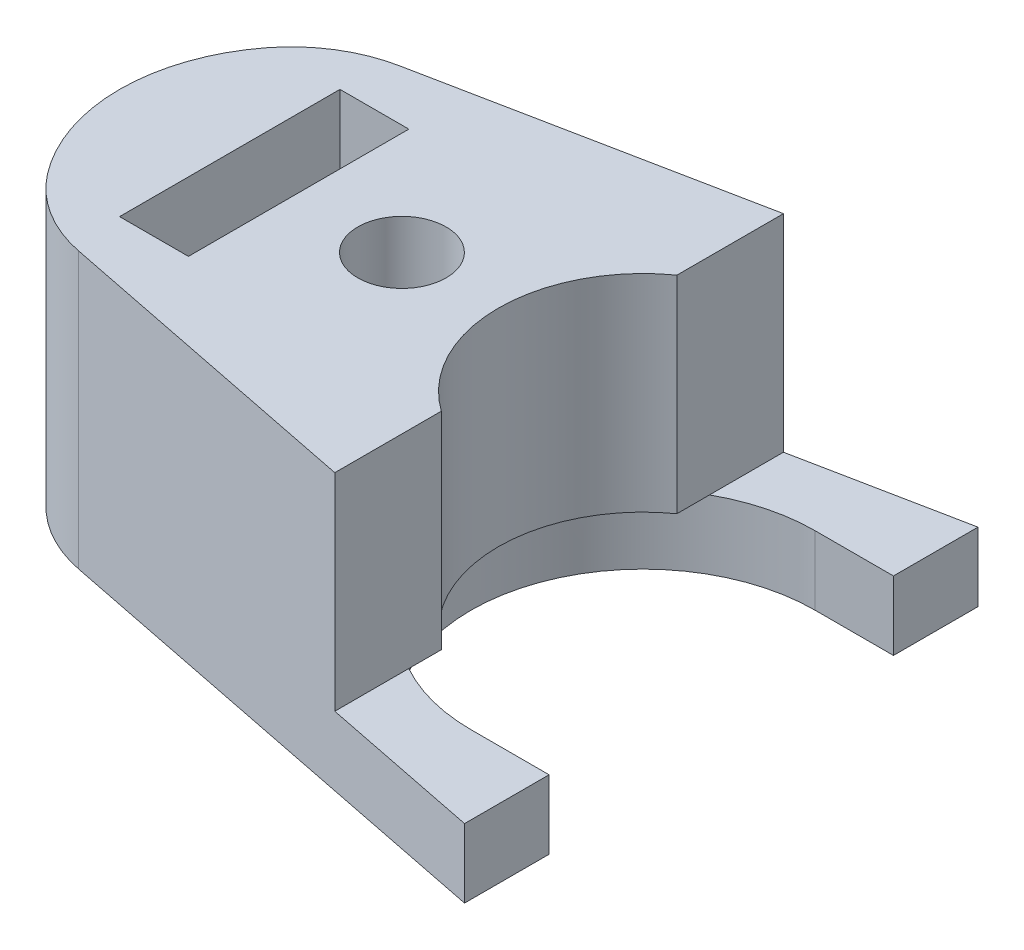
ISO-10303-21;
HEADER;
FILE_DESCRIPTION(('STEP AP214'),'2;1');
FILE_NAME('part.step','',(''),(''),'','','');
FILE_SCHEMA(('AUTOMOTIVE_DESIGN { 1 0 10303 214 1 1 1 1 }'));
ENDSEC;
DATA;
#1=APPLICATION_CONTEXT('core data for automotive mechanical design processes');
#2=APPLICATION_PROTOCOL_DEFINITION('international standard','automotive_design',2000,#1);
#3=PRODUCT_CONTEXT('',#1,'mechanical');
#4=PRODUCT('Part','Part','',(#3));
#5=PRODUCT_RELATED_PRODUCT_CATEGORY('part','',(#4));
#6=PRODUCT_DEFINITION_FORMATION('','',#4);
#7=PRODUCT_DEFINITION_CONTEXT('part definition',#1,'design');
#8=PRODUCT_DEFINITION('design','',#6,#7);
#9=PRODUCT_DEFINITION_SHAPE('','',#8);
#10=(LENGTH_UNIT() NAMED_UNIT(*) SI_UNIT(.MILLI.,.METRE.));
#11=(NAMED_UNIT(*) PLANE_ANGLE_UNIT() SI_UNIT($,.RADIAN.));
#12=(NAMED_UNIT(*) SI_UNIT($,.STERADIAN.) SOLID_ANGLE_UNIT());
#13=UNCERTAINTY_MEASURE_WITH_UNIT(LENGTH_MEASURE(1.E-05),#10,'distance_accuracy_value','');
#14=(GEOMETRIC_REPRESENTATION_CONTEXT(3) GLOBAL_UNCERTAINTY_ASSIGNED_CONTEXT((#13)) GLOBAL_UNIT_ASSIGNED_CONTEXT((#10,
#11,#12)) REPRESENTATION_CONTEXT('',''));
#15=CARTESIAN_POINT('',(0.,0.,0.));
#16=DIRECTION('',(0.,0.,1.));
#17=DIRECTION('',(1.,0.,0.));
#18=AXIS2_PLACEMENT_3D('',#15,#16,#17);
#19=CARTESIAN_POINT('',(0.,0.5,0.));
#20=DIRECTION('',(0.,1.,0.));
#21=DIRECTION('',(0.,0.,1.));
#22=AXIS2_PLACEMENT_3D('',#19,#20,#21);
#23=PLANE('',#22);
#24=CARTESIAN_POINT('',(-1.24999999999968,0.5,0.));
#25=DIRECTION('',(0.,1.,0.));
#26=DIRECTION('',(0.,0.,1.));
#27=AXIS2_PLACEMENT_3D('',#24,#25,#26);
#28=CIRCLE('',#27,1.24999999999969);
#29=CARTESIAN_POINT('',(-1.85903885005184,0.5,1.09159135170922));
#30=VERTEX_POINT('',#29);
#31=CARTESIAN_POINT('',(-1.24999999999968,0.5,1.24999999999969));
#32=VERTEX_POINT('',#31);
#33=EDGE_CURVE('E164',#30,#32,#28,.T.);
#34=ORIENTED_EDGE('',*,*,#33,.F.);
#35=DIRECTION('',(0.,0.,1.));
#36=VECTOR('',#35,1.);
#37=CARTESIAN_POINT('',(-1.85903885005184,0.5,0.));
#38=LINE('',#37,#36);
#39=CARTESIAN_POINT('',(-1.85903885005184,0.5,1.62855091172946));
#40=VERTEX_POINT('',#39);
#41=EDGE_CURVE('E11',#30,#40,#38,.T.);
#42=ORIENTED_EDGE('',*,*,#41,.T.);
#43=DIRECTION('',(-0.980617043355843,0.,-0.195934209060197));
#44=VECTOR('',#43,1.);
#45=CARTESIAN_POINT('',(-0.384272849561752,0.5,1.92321957143991));
#46=LINE('',#45,#44);
#47=CARTESIAN_POINT('',(-0.681941879985558,0.5,1.86374319742319));
#48=VERTEX_POINT('',#47);
#49=EDGE_CURVE('E174',#48,#40,#46,.T.);
#50=ORIENTED_EDGE('',*,*,#49,.F.);
#51=DIRECTION('',(0.,0.,1.));
#52=VECTOR('',#51,1.);
#53=CARTESIAN_POINT('',(-0.681941879985558,0.5,0.));
#54=LINE('',#53,#52);
#55=CARTESIAN_POINT('',(-0.681941879985558,0.5,1.24999999999969));
#56=VERTEX_POINT('',#55);
#57=EDGE_CURVE('E170',#56,#48,#54,.T.);
#58=ORIENTED_EDGE('',*,*,#57,.F.);
#59=DIRECTION('',(1.,0.,0.));
#60=VECTOR('',#59,1.);
#61=CARTESIAN_POINT('',(0.,0.5,1.24999999999969));
#62=LINE('',#61,#60);
#63=EDGE_CURVE('E166',#32,#56,#62,.T.);
#64=ORIENTED_EDGE('',*,*,#63,.F.);
#65=EDGE_LOOP('',(#34,#42,#50,#58,#64));
#66=FACE_BOUND('',#65,.T.);
#67=ADVANCED_FACE('F37',(#66),#23,.T.);
#68=DIRECTION('',(-0.980617043325648,0.,0.195934209211316));
#69=VECTOR('',#68,1.);
#70=CARTESIAN_POINT('',(-0.384272849884788,0.5,-1.92321957151411));
#71=LINE('',#70,#69);
#72=CARTESIAN_POINT('',(-0.681941879985558,0.5,-1.86374319751422));
#73=VERTEX_POINT('',#72);
#74=CARTESIAN_POINT('',(-1.85903885005184,0.5,-1.62855091163185));
#75=VERTEX_POINT('',#74);
#76=EDGE_CURVE('E63',#73,#75,#71,.T.);
#77=ORIENTED_EDGE('',*,*,#76,.T.);
#78=DIRECTION('',(0.,0.,1.));
#79=VECTOR('',#78,1.);
#80=CARTESIAN_POINT('',(-1.85903885005184,0.5,0.));
#81=LINE('',#80,#79);
#82=CARTESIAN_POINT('',(-1.85903885005184,0.5,-1.09159135170923));
#83=VERTEX_POINT('',#82);
#84=EDGE_CURVE('E161',#75,#83,#81,.T.);
#85=ORIENTED_EDGE('',*,*,#84,.T.);
#86=CARTESIAN_POINT('',(-1.24999999999968,0.5,-1.2499999999997));
#87=VERTEX_POINT('',#86);
#88=EDGE_CURVE('E142',#87,#83,#28,.T.);
#89=ORIENTED_EDGE('',*,*,#88,.F.);
#90=DIRECTION('',(1.,0.,0.));
#91=VECTOR('',#90,1.);
#92=CARTESIAN_POINT('',(0.,0.5,-1.2499999999997));
#93=LINE('',#92,#91);
#94=CARTESIAN_POINT('',(-0.681941879985558,0.5,-1.2499999999997));
#95=VERTEX_POINT('',#94);
#96=EDGE_CURVE('E153',#87,#95,#93,.T.);
#97=ORIENTED_EDGE('',*,*,#96,.T.);
#98=DIRECTION('',(0.,0.,-1.));
#99=VECTOR('',#98,1.);
#100=CARTESIAN_POINT('',(-0.681941879985558,0.5,0.));
#101=LINE('',#100,#99);
#102=EDGE_CURVE('E157',#95,#73,#101,.T.);
#103=ORIENTED_EDGE('',*,*,#102,.T.);
#104=EDGE_LOOP('',(#77,#85,#89,#97,#103));
#105=FACE_BOUND('',#104,.T.);
#106=ADVANCED_FACE('F160',(#105),#23,.T.);
#107=CARTESIAN_POINT('',(0.,0.5,-0.8));
#108=DIRECTION('',(0.,0.,-1.));
#109=DIRECTION('',(-1.,0.,0.));
#110=AXIS2_PLACEMENT_3D('',#107,#108,#109);
#111=PLANE('',#110);
#112=DIRECTION('',(1.,0.,0.));
#113=VECTOR('',#112,1.);
#114=CARTESIAN_POINT('',(0.,0.,-0.8));
#115=LINE('',#114,#113);
#116=CARTESIAN_POINT('',(-4.25,0.,-0.8));
#117=VERTEX_POINT('',#116);
#118=CARTESIAN_POINT('',(-3.75,0.,-0.8));
#119=VERTEX_POINT('',#118);
#120=EDGE_CURVE('E224',#117,#119,#115,.T.);
#121=ORIENTED_EDGE('',*,*,#120,.T.);
#122=DIRECTION('',(0.,-1.,0.));
#123=VECTOR('',#122,1.);
#124=CARTESIAN_POINT('',(-3.75,0.5,-0.8));
#125=LINE('',#124,#123);
#126=CARTESIAN_POINT('',(-3.75,2.,-0.8));
#127=VERTEX_POINT('',#126);
#128=EDGE_CURVE('E46',#127,#119,#125,.T.);
#129=ORIENTED_EDGE('',*,*,#128,.F.);
#130=DIRECTION('',(1.,0.,0.));
#131=VECTOR('',#130,1.);
#132=CARTESIAN_POINT('',(0.,2.,-0.8));
#133=LINE('',#132,#131);
#134=CARTESIAN_POINT('',(-4.25,2.,-0.8));
#135=VERTEX_POINT('',#134);
#136=EDGE_CURVE('E358',#135,#127,#133,.T.);
#137=ORIENTED_EDGE('',*,*,#136,.F.);
#138=DIRECTION('',(0.,-1.,0.));
#139=VECTOR('',#138,1.);
#140=CARTESIAN_POINT('',(-4.25,0.5,-0.8));
#141=LINE('',#140,#139);
#142=EDGE_CURVE('E116',#135,#117,#141,.T.);
#143=ORIENTED_EDGE('',*,*,#142,.T.);
#144=EDGE_LOOP('',(#121,#129,#137,#143));
#145=FACE_BOUND('',#144,.T.);
#146=ADVANCED_FACE('F396',(#145),#111,.F.);
#147=CARTESIAN_POINT('',(-3.75,0.5,0.));
#148=DIRECTION('',(1.,0.,0.));
#149=DIRECTION('',(0.,0.,-1.));
#150=AXIS2_PLACEMENT_3D('',#147,#148,#149);
#151=PLANE('',#150);
#152=DIRECTION('',(0.,0.,1.));
#153=VECTOR('',#152,1.);
#154=CARTESIAN_POINT('',(-3.75,0.,0.));
#155=LINE('',#154,#153);
#156=CARTESIAN_POINT('',(-3.75,0.,0.8));
#157=VERTEX_POINT('',#156);
#158=EDGE_CURVE('E226',#119,#157,#155,.T.);
#159=ORIENTED_EDGE('',*,*,#158,.T.);
#160=DIRECTION('',(0.,-1.,0.));
#161=VECTOR('',#160,1.);
#162=CARTESIAN_POINT('',(-3.75,0.5,0.8));
#163=LINE('',#162,#161);
#164=CARTESIAN_POINT('',(-3.75,2.,0.8));
#165=VERTEX_POINT('',#164);
#166=EDGE_CURVE('E237',#165,#157,#163,.T.);
#167=ORIENTED_EDGE('',*,*,#166,.F.);
#168=DIRECTION('',(0.,0.,1.));
#169=VECTOR('',#168,1.);
#170=CARTESIAN_POINT('',(-3.75,2.,0.));
#171=LINE('',#170,#169);
#172=EDGE_CURVE('E361',#127,#165,#171,.T.);
#173=ORIENTED_EDGE('',*,*,#172,.F.);
#174=ORIENTED_EDGE('',*,*,#128,.T.);
#175=EDGE_LOOP('',(#159,#167,#173,#174));
#176=FACE_BOUND('',#175,.T.);
#177=ADVANCED_FACE('F409',(#176),#151,.F.);
#178=CARTESIAN_POINT('',(0.,0.5,0.8));
#179=DIRECTION('',(0.,0.,-1.));
#180=DIRECTION('',(-1.,0.,0.));
#181=AXIS2_PLACEMENT_3D('',#178,#179,#180);
#182=PLANE('',#181);
#183=DIRECTION('',(1.,0.,0.));
#184=VECTOR('',#183,1.);
#185=CARTESIAN_POINT('',(0.,0.,0.8));
#186=LINE('',#185,#184);
#187=CARTESIAN_POINT('',(-4.25,0.,0.8));
#188=VERTEX_POINT('',#187);
#189=EDGE_CURVE('E229',#188,#157,#186,.T.);
#190=ORIENTED_EDGE('',*,*,#189,.F.);
#191=DIRECTION('',(0.,-1.,0.));
#192=VECTOR('',#191,1.);
#193=CARTESIAN_POINT('',(-4.25,0.5,0.8));
#194=LINE('',#193,#192);
#195=CARTESIAN_POINT('',(-4.25,2.,0.8));
#196=VERTEX_POINT('',#195);
#197=EDGE_CURVE('E235',#196,#188,#194,.T.);
#198=ORIENTED_EDGE('',*,*,#197,.F.);
#199=DIRECTION('',(1.,0.,0.));
#200=VECTOR('',#199,1.);
#201=CARTESIAN_POINT('',(0.,2.,0.8));
#202=LINE('',#201,#200);
#203=EDGE_CURVE('E364',#196,#165,#202,.T.);
#204=ORIENTED_EDGE('',*,*,#203,.T.);
#205=ORIENTED_EDGE('',*,*,#166,.T.);
#206=EDGE_LOOP('',(#190,#198,#204,#205));
#207=FACE_BOUND('',#206,.T.);
#208=ADVANCED_FACE('F406',(#207),#182,.T.);
#209=CARTESIAN_POINT('',(-3.9873014814638,0.5,0.183542929297438));
#210=DIRECTION('',(0.,-1.,0.));
#211=DIRECTION('',(0.,0.,-1.));
#212=AXIS2_PLACEMENT_3D('',#209,#210,#211);
#213=CYLINDRICAL_SURFACE('',#212,0.999999999999999);
#214=CARTESIAN_POINT('',(-3.9873014814638,0.,0.183542929297438));
#215=DIRECTION('',(0.,1.,0.));
#216=DIRECTION('',(0.,0.,1.));
#217=AXIS2_PLACEMENT_3D('',#214,#215,#216);
#218=CIRCLE('',#217,0.999999999999999);
#219=CARTESIAN_POINT('',(-4.183235690524,0.,1.16415997265328));
#220=VERTEX_POINT('',#219);
#221=CARTESIAN_POINT('',(-4.7783064194944,0.,0.795352693857639));
#222=VERTEX_POINT('',#221);
#223=EDGE_CURVE('E197',#220,#222,#218,.F.);
#224=ORIENTED_EDGE('',*,*,#223,.F.);
#225=DIRECTION('',(0.,-1.,0.));
#226=VECTOR('',#225,1.);
#227=CARTESIAN_POINT('',(-4.183235690524,0.5,1.16415997265328));
#228=LINE('',#227,#226);
#229=CARTESIAN_POINT('',(-4.183235690524,2.,1.16415997265328));
#230=VERTEX_POINT('',#229);
#231=EDGE_CURVE('E185',#230,#220,#228,.T.);
#232=ORIENTED_EDGE('',*,*,#231,.F.);
#233=CARTESIAN_POINT('',(-3.9873014814638,2.,0.183542929297438));
#234=DIRECTION('',(0.,1.,0.));
#235=DIRECTION('',(0.,0.,1.));
#236=AXIS2_PLACEMENT_3D('',#233,#234,#235);
#237=CIRCLE('',#236,0.999999999999999);
#238=CARTESIAN_POINT('',(-4.7783064194944,2.,0.795352693857639));
#239=VERTEX_POINT('',#238);
#240=EDGE_CURVE('E351',#230,#239,#237,.F.);
#241=ORIENTED_EDGE('',*,*,#240,.T.);
#242=DIRECTION('',(0.,-1.,0.));
#243=VECTOR('',#242,1.);
#244=CARTESIAN_POINT('',(-4.7783064194944,0.5,0.795352693857639));
#245=LINE('',#244,#243);
#246=EDGE_CURVE('E188',#239,#222,#245,.T.);
#247=ORIENTED_EDGE('',*,*,#246,.T.);
#248=EDGE_LOOP('',(#224,#232,#241,#247));
#249=FACE_BOUND('',#248,.T.);
#250=ADVANCED_FACE('F266',(#249),#213,.T.);
#251=CARTESIAN_POINT('',(-0.384272849561752,0.5,1.92321957143991));
#252=DIRECTION('',(-0.195934209060197,0.,0.980617043355843));
#253=DIRECTION('',(0.980617043355843,0.,0.195934209060197));
#254=AXIS2_PLACEMENT_3D('',#251,#252,#253);
#255=PLANE('',#254);
#256=DIRECTION('',(-0.980617043355843,0.,-0.195934209060197));
#257=VECTOR('',#256,1.);
#258=CARTESIAN_POINT('',(-0.384272849561752,0.,1.92321957143991));
#259=LINE('',#258,#257);
#260=CARTESIAN_POINT('',(-0.681941879985558,0.,1.86374319742319));
#261=VERTEX_POINT('',#260);
#262=EDGE_CURVE('E200',#261,#220,#259,.T.);
#263=ORIENTED_EDGE('',*,*,#262,.F.);
#264=DIRECTION('',(0.,-1.,0.));
#265=VECTOR('',#264,1.);
#266=CARTESIAN_POINT('',(-0.681941879985558,0.5,1.86374319742319));
#267=LINE('',#266,#265);
#268=EDGE_CURVE('E124',#48,#261,#267,.T.);
#269=ORIENTED_EDGE('',*,*,#268,.F.);
#270=ORIENTED_EDGE('',*,*,#49,.T.);
#271=DIRECTION('',(0.,-1.,0.));
#272=VECTOR('',#271,1.);
#273=CARTESIAN_POINT('',(-1.85903885005184,2.,1.62855091172946));
#274=LINE('',#273,#272);
#275=CARTESIAN_POINT('',(-1.85903885005184,2.,1.62855091172946));
#276=VERTEX_POINT('',#275);
#277=EDGE_CURVE('E279',#276,#40,#274,.T.);
#278=ORIENTED_EDGE('',*,*,#277,.F.);
#279=DIRECTION('',(-0.980617043355843,0.,-0.195934209060197));
#280=VECTOR('',#279,1.);
#281=CARTESIAN_POINT('',(-0.384272849561752,2.,1.92321957143991));
#282=LINE('',#281,#280);
#283=EDGE_CURVE('E262',#276,#230,#282,.T.);
#284=ORIENTED_EDGE('',*,*,#283,.T.);
#285=ORIENTED_EDGE('',*,*,#231,.T.);
#286=EDGE_LOOP('',(#263,#269,#270,#278,#284,#285));
#287=FACE_BOUND('',#286,.T.);
#288=ADVANCED_FACE('F258',(#287),#255,.T.);
#289=CARTESIAN_POINT('',(-0.681941879985558,0.5,0.));
#290=DIRECTION('',(1.,0.,0.));
#291=DIRECTION('',(0.,0.,-1.));
#292=AXIS2_PLACEMENT_3D('',#289,#290,#291);
#293=PLANE('',#292);
#294=DIRECTION('',(0.,0.,1.));
#295=VECTOR('',#294,1.);
#296=CARTESIAN_POINT('',(-0.681941879985558,0.,0.));
#297=LINE('',#296,#295);
#298=CARTESIAN_POINT('',(-0.681941879985558,0.,1.24999999999969));
#299=VERTEX_POINT('',#298);
#300=EDGE_CURVE('E203',#299,#261,#297,.T.);
#301=ORIENTED_EDGE('',*,*,#300,.F.);
#302=DIRECTION('',(0.,-1.,0.));
#303=VECTOR('',#302,1.);
#304=CARTESIAN_POINT('',(-0.681941879985558,0.5,1.24999999999969));
#305=LINE('',#304,#303);
#306=EDGE_CURVE('E252',#56,#299,#305,.T.);
#307=ORIENTED_EDGE('',*,*,#306,.F.);
#308=ORIENTED_EDGE('',*,*,#57,.T.);
#309=ORIENTED_EDGE('',*,*,#268,.T.);
#310=EDGE_LOOP('',(#301,#307,#308,#309));
#311=FACE_BOUND('',#310,.T.);
#312=ADVANCED_FACE('F272',(#311),#293,.T.);
#313=CARTESIAN_POINT('',(0.,0.5,1.24999999999969));
#314=DIRECTION('',(0.,0.,-1.));
#315=DIRECTION('',(-1.,0.,0.));
#316=AXIS2_PLACEMENT_3D('',#313,#314,#315);
#317=PLANE('',#316);
#318=DIRECTION('',(1.,0.,0.));
#319=VECTOR('',#318,1.);
#320=CARTESIAN_POINT('',(0.,0.,1.24999999999969));
#321=LINE('',#320,#319);
#322=CARTESIAN_POINT('',(-1.24999999999968,0.,1.24999999999969));
#323=VERTEX_POINT('',#322);
#324=EDGE_CURVE('E206',#323,#299,#321,.T.);
#325=ORIENTED_EDGE('',*,*,#324,.F.);
#326=DIRECTION('',(0.,-1.,0.));
#327=VECTOR('',#326,1.);
#328=CARTESIAN_POINT('',(-1.24999999999968,0.5,1.24999999999969));
#329=LINE('',#328,#327);
#330=EDGE_CURVE('E148',#32,#323,#329,.T.);
#331=ORIENTED_EDGE('',*,*,#330,.F.);
#332=ORIENTED_EDGE('',*,*,#63,.T.);
#333=ORIENTED_EDGE('',*,*,#306,.T.);
#334=EDGE_LOOP('',(#325,#331,#332,#333));
#335=FACE_BOUND('',#334,.T.);
#336=ADVANCED_FACE('F435',(#335),#317,.T.);
#337=CARTESIAN_POINT('',(-1.24999999999968,0.5,0.));
#338=DIRECTION('',(0.,-1.,0.));
#339=DIRECTION('',(0.,0.,-1.));
#340=AXIS2_PLACEMENT_3D('',#337,#338,#339);
#341=CYLINDRICAL_SURFACE('',#340,1.24999999999969);
#342=CARTESIAN_POINT('',(-1.24999999999968,0.,0.));
#343=DIRECTION('',(0.,1.,0.));
#344=DIRECTION('',(0.,0.,1.));
#345=AXIS2_PLACEMENT_3D('',#342,#343,#344);
#346=CIRCLE('',#345,1.24999999999969);
#347=CARTESIAN_POINT('',(-1.24999999999968,0.,-1.2499999999997));
#348=VERTEX_POINT('',#347);
#349=EDGE_CURVE('E144',#348,#323,#346,.T.);
#350=ORIENTED_EDGE('',*,*,#349,.F.);
#351=DIRECTION('',(0.,-1.,0.));
#352=VECTOR('',#351,1.);
#353=CARTESIAN_POINT('',(-1.24999999999968,0.5,-1.2499999999997));
#354=LINE('',#353,#352);
#355=EDGE_CURVE('E137',#87,#348,#354,.T.);
#356=ORIENTED_EDGE('',*,*,#355,.F.);
#357=ORIENTED_EDGE('',*,*,#88,.T.);
#358=EDGE_CURVE('E162',#83,#30,#28,.T.);
#359=ORIENTED_EDGE('',*,*,#358,.T.);
#360=ORIENTED_EDGE('',*,*,#33,.T.);
#361=ORIENTED_EDGE('',*,*,#330,.T.);
#362=EDGE_LOOP('',(#350,#356,#357,#359,#360,#361));
#363=FACE_BOUND('',#362,.T.);
#364=ADVANCED_FACE('F139',(#363),#341,.F.);
#365=CARTESIAN_POINT('',(0.,0.5,-1.2499999999997));
#366=DIRECTION('',(0.,0.,-1.));
#367=DIRECTION('',(-1.,0.,0.));
#368=AXIS2_PLACEMENT_3D('',#365,#366,#367);
#369=PLANE('',#368);
#370=DIRECTION('',(1.,0.,0.));
#371=VECTOR('',#370,1.);
#372=CARTESIAN_POINT('',(0.,0.,-1.2499999999997));
#373=LINE('',#372,#371);
#374=CARTESIAN_POINT('',(-0.681941879985558,0.,-1.2499999999997));
#375=VERTEX_POINT('',#374);
#376=EDGE_CURVE('E210',#348,#375,#373,.T.);
#377=ORIENTED_EDGE('',*,*,#376,.T.);
#378=DIRECTION('',(0.,-1.,0.));
#379=VECTOR('',#378,1.);
#380=CARTESIAN_POINT('',(-0.681941879985558,0.5,-1.2499999999997));
#381=LINE('',#380,#379);
#382=EDGE_CURVE('E149',#95,#375,#381,.T.);
#383=ORIENTED_EDGE('',*,*,#382,.F.);
#384=ORIENTED_EDGE('',*,*,#96,.F.);
#385=ORIENTED_EDGE('',*,*,#355,.T.);
#386=EDGE_LOOP('',(#377,#383,#384,#385));
#387=FACE_BOUND('',#386,.T.);
#388=ADVANCED_FACE('F154',(#387),#369,.F.);
#389=CARTESIAN_POINT('',(-0.681941879985558,0.5,0.));
#390=DIRECTION('',(-1.,0.,0.));
#391=DIRECTION('',(0.,0.,1.));
#392=AXIS2_PLACEMENT_3D('',#389,#390,#391);
#393=PLANE('',#392);
#394=DIRECTION('',(0.,0.,-1.));
#395=VECTOR('',#394,1.);
#396=CARTESIAN_POINT('',(-0.681941879985558,0.,0.));
#397=LINE('',#396,#395);
#398=CARTESIAN_POINT('',(-0.681941879985558,0.,-1.86374319751422));
#399=VERTEX_POINT('',#398);
#400=EDGE_CURVE('E212',#375,#399,#397,.T.);
#401=ORIENTED_EDGE('',*,*,#400,.T.);
#402=DIRECTION('',(0.,-1.,0.));
#403=VECTOR('',#402,1.);
#404=CARTESIAN_POINT('',(-0.681941879985558,0.5,-1.86374319751422));
#405=LINE('',#404,#403);
#406=EDGE_CURVE('E248',#73,#399,#405,.T.);
#407=ORIENTED_EDGE('',*,*,#406,.F.);
#408=ORIENTED_EDGE('',*,*,#102,.F.);
#409=ORIENTED_EDGE('',*,*,#382,.T.);
#410=EDGE_LOOP('',(#401,#407,#408,#409));
#411=FACE_BOUND('',#410,.T.);
#412=ADVANCED_FACE('F427',(#411),#393,.F.);
#413=CARTESIAN_POINT('',(-0.384272849884788,0.5,-1.92321957151411));
#414=DIRECTION('',(0.195934209211316,0.,0.980617043325648));
#415=DIRECTION('',(0.980617043325648,0.,-0.195934209211316));
#416=AXIS2_PLACEMENT_3D('',#413,#414,#415);
#417=PLANE('',#416);
#418=DIRECTION('',(-0.980617043325648,0.,0.195934209211316));
#419=VECTOR('',#418,1.);
#420=CARTESIAN_POINT('',(-0.384272849884788,0.,-1.92321957151411));
#421=LINE('',#420,#419);
#422=CARTESIAN_POINT('',(-4.18323569123438,0.,-1.16415997204127));
#423=VERTEX_POINT('',#422);
#424=EDGE_CURVE('E215',#399,#423,#421,.T.);
#425=ORIENTED_EDGE('',*,*,#424,.T.);
#426=DIRECTION('',(0.,-1.,0.));
#427=VECTOR('',#426,1.);
#428=CARTESIAN_POINT('',(-4.18323569123438,0.5,-1.16415997204127));
#429=LINE('',#428,#427);
#430=CARTESIAN_POINT('',(-4.18323569123438,2.,-1.16415997204127));
#431=VERTEX_POINT('',#430);
#432=EDGE_CURVE('E245',#431,#423,#429,.T.);
#433=ORIENTED_EDGE('',*,*,#432,.F.);
#434=DIRECTION('',(-0.980617043325648,0.,0.195934209211316));
#435=VECTOR('',#434,1.);
#436=CARTESIAN_POINT('',(-0.384272849884788,2.,-1.92321957151411));
#437=LINE('',#436,#435);
#438=CARTESIAN_POINT('',(-1.85903885005184,2.,-1.62855091163185));
#439=VERTEX_POINT('',#438);
#440=EDGE_CURVE('E341',#439,#431,#437,.T.);
#441=ORIENTED_EDGE('',*,*,#440,.F.);
#442=DIRECTION('',(0.,-1.,0.));
#443=VECTOR('',#442,1.);
#444=CARTESIAN_POINT('',(-1.85903885005184,2.,-1.62855091163185));
#445=LINE('',#444,#443);
#446=EDGE_CURVE('E329',#439,#75,#445,.T.);
#447=ORIENTED_EDGE('',*,*,#446,.T.);
#448=ORIENTED_EDGE('',*,*,#76,.F.);
#449=ORIENTED_EDGE('',*,*,#406,.T.);
#450=EDGE_LOOP('',(#425,#433,#441,#447,#448,#449));
#451=FACE_BOUND('',#450,.T.);
#452=ADVANCED_FACE('F423',(#451),#417,.F.);
#453=CARTESIAN_POINT('',(-3.98730148202306,0.5,-0.18354292871562));
#454=DIRECTION('',(0.,-1.,0.));
#455=DIRECTION('',(0.,0.,-1.));
#456=AXIS2_PLACEMENT_3D('',#453,#454,#455);
#457=CYLINDRICAL_SURFACE('',#456,0.999999999999999);
#458=CARTESIAN_POINT('',(-3.98730148202306,0.,-0.18354292871562));
#459=DIRECTION('',(0.,1.,0.));
#460=DIRECTION('',(0.,0.,1.));
#461=AXIS2_PLACEMENT_3D('',#458,#459,#460);
#462=CIRCLE('',#461,0.999999999999999);
#463=CARTESIAN_POINT('',(-4.77830642191786,0.,-0.795352690865612));
#464=VERTEX_POINT('',#463);
#465=EDGE_CURVE('E218',#423,#464,#462,.T.);
#466=ORIENTED_EDGE('',*,*,#465,.T.);
#467=DIRECTION('',(0.,-1.,0.));
#468=VECTOR('',#467,1.);
#469=CARTESIAN_POINT('',(-4.77830642191786,0.5,-0.795352690865612));
#470=LINE('',#469,#468);
#471=CARTESIAN_POINT('',(-4.77830642191786,2.,-0.795352690865612));
#472=VERTEX_POINT('',#471);
#473=EDGE_CURVE('E242',#472,#464,#470,.T.);
#474=ORIENTED_EDGE('',*,*,#473,.F.);
#475=CARTESIAN_POINT('',(-3.98730148202306,2.,-0.18354292871562));
#476=DIRECTION('',(0.,1.,0.));
#477=DIRECTION('',(0.,0.,1.));
#478=AXIS2_PLACEMENT_3D('',#475,#476,#477);
#479=CIRCLE('',#478,0.999999999999999);
#480=EDGE_CURVE('E343',#431,#472,#479,.T.);
#481=ORIENTED_EDGE('',*,*,#480,.F.);
#482=ORIENTED_EDGE('',*,*,#432,.T.);
#483=EDGE_LOOP('',(#466,#474,#481,#482));
#484=FACE_BOUND('',#483,.T.);
#485=ADVANCED_FACE('F419',(#484),#457,.T.);
#486=CARTESIAN_POINT('',(-3.75000000005462,0.5,-7.06220301719767E-11));
#487=DIRECTION('',(0.,-1.,0.));
#488=DIRECTION('',(0.,0.,-1.));
#489=AXIS2_PLACEMENT_3D('',#486,#487,#488);
#490=CYLINDRICAL_SURFACE('',#489,1.3);
#491=CARTESIAN_POINT('',(-3.75000000005462,0.,-7.06220301719767E-11));
#492=DIRECTION('',(0.,1.,0.));
#493=DIRECTION('',(0.,0.,1.));
#494=AXIS2_PLACEMENT_3D('',#491,#492,#493);
#495=CIRCLE('',#494,1.3);
#496=EDGE_CURVE('E221',#464,#222,#495,.T.);
#497=ORIENTED_EDGE('',*,*,#496,.T.);
#498=ORIENTED_EDGE('',*,*,#246,.F.);
#499=CARTESIAN_POINT('',(-3.75000000005462,2.,-7.06220301719767E-11));
#500=DIRECTION('',(0.,1.,0.));
#501=DIRECTION('',(0.,0.,1.));
#502=AXIS2_PLACEMENT_3D('',#499,#500,#501);
#503=CIRCLE('',#502,1.3);
#504=EDGE_CURVE('E348',#472,#239,#503,.T.);
#505=ORIENTED_EDGE('',*,*,#504,.F.);
#506=ORIENTED_EDGE('',*,*,#473,.T.);
#507=EDGE_LOOP('',(#497,#498,#505,#506));
#508=FACE_BOUND('',#507,.T.);
#509=ADVANCED_FACE('F416',(#508),#490,.T.);
#510=CARTESIAN_POINT('',(-3.,0.5,0.));
#511=DIRECTION('',(0.,-1.,0.));
#512=DIRECTION('',(0.,0.,-1.));
#513=AXIS2_PLACEMENT_3D('',#510,#511,#512);
#514=CYLINDRICAL_SURFACE('',#513,0.3207);
#515=CARTESIAN_POINT('',(-3.,0.,0.));
#516=DIRECTION('',(0.,1.,0.));
#517=DIRECTION('',(0.,0.,1.));
#518=AXIS2_PLACEMENT_3D('',#515,#516,#517);
#519=CIRCLE('',#518,0.3207);
#520=CARTESIAN_POINT('',(-3.,0.,0.3207));
#521=VERTEX_POINT('',#520);
#522=EDGE_CURVE('E194',#521,#521,#519,.T.);
#523=ORIENTED_EDGE('',*,*,#522,.F.);
#524=EDGE_LOOP('',(#523));
#525=FACE_BOUND('',#524,.T.);
#526=CARTESIAN_POINT('',(-3.,2.,0.));
#527=DIRECTION('',(0.,1.,0.));
#528=DIRECTION('',(0.,0.,1.));
#529=AXIS2_PLACEMENT_3D('',#526,#527,#528);
#530=CIRCLE('',#529,0.3207);
#531=CARTESIAN_POINT('',(-3.,2.,0.3207));
#532=VERTEX_POINT('',#531);
#533=EDGE_CURVE('E355',#532,#532,#530,.T.);
#534=ORIENTED_EDGE('',*,*,#533,.T.);
#535=EDGE_LOOP('',(#534));
#536=FACE_BOUND('',#535,.T.);
#537=ADVANCED_FACE('F39',(#525,#536),#514,.F.);
#538=CARTESIAN_POINT('',(-4.25,0.5,0.));
#539=DIRECTION('',(1.,0.,0.));
#540=DIRECTION('',(0.,0.,-1.));
#541=AXIS2_PLACEMENT_3D('',#538,#539,#540);
#542=PLANE('',#541);
#543=DIRECTION('',(0.,0.,1.));
#544=VECTOR('',#543,1.);
#545=CARTESIAN_POINT('',(-4.25,0.,0.));
#546=LINE('',#545,#544);
#547=EDGE_CURVE('E184',#117,#188,#546,.T.);
#548=ORIENTED_EDGE('',*,*,#547,.F.);
#549=ORIENTED_EDGE('',*,*,#142,.F.);
#550=DIRECTION('',(0.,0.,1.));
#551=VECTOR('',#550,1.);
#552=CARTESIAN_POINT('',(-4.25,2.,0.));
#553=LINE('',#552,#551);
#554=EDGE_CURVE('E367',#135,#196,#553,.T.);
#555=ORIENTED_EDGE('',*,*,#554,.T.);
#556=ORIENTED_EDGE('',*,*,#197,.T.);
#557=EDGE_LOOP('',(#548,#549,#555,#556));
#558=FACE_BOUND('',#557,.T.);
#559=ADVANCED_FACE('F401',(#558),#542,.T.);
#560=CARTESIAN_POINT('',(0.,0.,0.));
#561=DIRECTION('',(0.,1.,0.));
#562=DIRECTION('',(0.,0.,1.));
#563=AXIS2_PLACEMENT_3D('',#560,#561,#562);
#564=PLANE('',#563);
#565=ORIENTED_EDGE('',*,*,#522,.T.);
#566=EDGE_LOOP('',(#565));
#567=FACE_BOUND('',#566,.T.);
#568=ORIENTED_EDGE('',*,*,#223,.T.);
#569=ORIENTED_EDGE('',*,*,#496,.F.);
#570=ORIENTED_EDGE('',*,*,#465,.F.);
#571=ORIENTED_EDGE('',*,*,#424,.F.);
#572=ORIENTED_EDGE('',*,*,#400,.F.);
#573=ORIENTED_EDGE('',*,*,#376,.F.);
#574=ORIENTED_EDGE('',*,*,#349,.T.);
#575=ORIENTED_EDGE('',*,*,#324,.T.);
#576=ORIENTED_EDGE('',*,*,#300,.T.);
#577=ORIENTED_EDGE('',*,*,#262,.T.);
#578=EDGE_LOOP('',(#568,#569,#570,#571,#572,#573,#574,#575,#576,#577));
#579=FACE_BOUND('',#578,.T.);
#580=ORIENTED_EDGE('',*,*,#120,.F.);
#581=ORIENTED_EDGE('',*,*,#547,.T.);
#582=ORIENTED_EDGE('',*,*,#189,.T.);
#583=ORIENTED_EDGE('',*,*,#158,.F.);
#584=EDGE_LOOP('',(#580,#581,#582,#583));
#585=FACE_BOUND('',#584,.T.);
#586=ADVANCED_FACE('F269',(#567,#579,#585),#564,.F.);
#587=CARTESIAN_POINT('',(-1.24999999999968,2.,0.));
#588=DIRECTION('',(0.,-1.,0.));
#589=DIRECTION('',(0.,0.,-1.));
#590=AXIS2_PLACEMENT_3D('',#587,#588,#589);
#591=CYLINDRICAL_SURFACE('',#590,1.04999999999969);
#592=CARTESIAN_POINT('',(-1.24999999999968,0.5,0.));
#593=DIRECTION('',(0.,1.,0.));
#594=DIRECTION('',(0.,0.,1.));
#595=AXIS2_PLACEMENT_3D('',#592,#593,#594);
#596=CIRCLE('',#595,1.04999999999969);
#597=CARTESIAN_POINT('',(-1.85903885005184,0.5,-0.855319635648866));
#598=VERTEX_POINT('',#597);
#599=CARTESIAN_POINT('',(-1.85903885005184,0.5,0.855319635648853));
#600=VERTEX_POINT('',#599);
#601=EDGE_CURVE('E327',#598,#600,#596,.T.);
#602=ORIENTED_EDGE('',*,*,#601,.F.);
#603=DIRECTION('',(0.,-1.,0.));
#604=VECTOR('',#603,1.);
#605=CARTESIAN_POINT('',(-1.85903885005184,2.,-0.855319635648866));
#606=LINE('',#605,#604);
#607=CARTESIAN_POINT('',(-1.85903885005184,2.,-0.855319635648866));
#608=VERTEX_POINT('',#607);
#609=EDGE_CURVE('E179',#608,#598,#606,.T.);
#610=ORIENTED_EDGE('',*,*,#609,.F.);
#611=CARTESIAN_POINT('',(-1.24999999999968,2.,0.));
#612=DIRECTION('',(0.,1.,0.));
#613=DIRECTION('',(0.,0.,1.));
#614=AXIS2_PLACEMENT_3D('',#611,#612,#613);
#615=CIRCLE('',#614,1.04999999999969);
#616=CARTESIAN_POINT('',(-1.85903885005184,2.,0.855319635648853));
#617=VERTEX_POINT('',#616);
#618=EDGE_CURVE('E324',#608,#617,#615,.T.);
#619=ORIENTED_EDGE('',*,*,#618,.T.);
#620=DIRECTION('',(0.,-1.,0.));
#621=VECTOR('',#620,1.);
#622=CARTESIAN_POINT('',(-1.85903885005184,2.,0.855319635648853));
#623=LINE('',#622,#621);
#624=EDGE_CURVE('E370',#617,#600,#623,.T.);
#625=ORIENTED_EDGE('',*,*,#624,.T.);
#626=EDGE_LOOP('',(#602,#610,#619,#625));
#627=FACE_BOUND('',#626,.T.);
#628=ADVANCED_FACE('F323',(#627),#591,.F.);
#629=CARTESIAN_POINT('',(-1.85903885005184,2.,0.));
#630=DIRECTION('',(1.,0.,0.));
#631=DIRECTION('',(0.,0.,-1.));
#632=AXIS2_PLACEMENT_3D('',#629,#630,#631);
#633=PLANE('',#632);
#634=ORIENTED_EDGE('',*,*,#84,.F.);
#635=ORIENTED_EDGE('',*,*,#446,.F.);
#636=DIRECTION('',(0.,0.,1.));
#637=VECTOR('',#636,1.);
#638=CARTESIAN_POINT('',(-1.85903885005184,2.,0.));
#639=LINE('',#638,#637);
#640=EDGE_CURVE('E335',#439,#608,#639,.T.);
#641=ORIENTED_EDGE('',*,*,#640,.T.);
#642=ORIENTED_EDGE('',*,*,#609,.T.);
#643=EDGE_CURVE('E54',#83,#598,#81,.T.);
#644=ORIENTED_EDGE('',*,*,#643,.F.);
#645=EDGE_LOOP('',(#634,#635,#641,#642,#644));
#646=FACE_BOUND('',#645,.T.);
#647=ADVANCED_FACE('F339',(#646),#633,.T.);
#648=CARTESIAN_POINT('',(-1.85903885005184,2.,0.));
#649=DIRECTION('',(1.,0.,0.));
#650=DIRECTION('',(0.,0.,-1.));
#651=AXIS2_PLACEMENT_3D('',#648,#649,#650);
#652=PLANE('',#651);
#653=EDGE_CURVE('E337',#600,#30,#38,.T.);
#654=ORIENTED_EDGE('',*,*,#653,.F.);
#655=ORIENTED_EDGE('',*,*,#624,.F.);
#656=DIRECTION('',(0.,0.,1.));
#657=VECTOR('',#656,1.);
#658=CARTESIAN_POINT('',(-1.85903885005184,2.,0.));
#659=LINE('',#658,#657);
#660=EDGE_CURVE('E336',#617,#276,#659,.T.);
#661=ORIENTED_EDGE('',*,*,#660,.T.);
#662=ORIENTED_EDGE('',*,*,#277,.T.);
#663=ORIENTED_EDGE('',*,*,#41,.F.);
#664=EDGE_LOOP('',(#654,#655,#661,#662,#663));
#665=FACE_BOUND('',#664,.T.);
#666=ADVANCED_FACE('F381',(#665),#652,.T.);
#667=CARTESIAN_POINT('',(0.,2.,0.));
#668=DIRECTION('',(0.,1.,0.));
#669=DIRECTION('',(0.,0.,1.));
#670=AXIS2_PLACEMENT_3D('',#667,#668,#669);
#671=PLANE('',#670);
#672=ORIENTED_EDGE('',*,*,#618,.F.);
#673=ORIENTED_EDGE('',*,*,#640,.F.);
#674=ORIENTED_EDGE('',*,*,#440,.T.);
#675=ORIENTED_EDGE('',*,*,#480,.T.);
#676=ORIENTED_EDGE('',*,*,#504,.T.);
#677=ORIENTED_EDGE('',*,*,#240,.F.);
#678=ORIENTED_EDGE('',*,*,#283,.F.);
#679=ORIENTED_EDGE('',*,*,#660,.F.);
#680=EDGE_LOOP('',(#672,#673,#674,#675,#676,#677,#678,#679));
#681=FACE_BOUND('',#680,.T.);
#682=ORIENTED_EDGE('',*,*,#533,.F.);
#683=EDGE_LOOP('',(#682));
#684=FACE_BOUND('',#683,.T.);
#685=ORIENTED_EDGE('',*,*,#136,.T.);
#686=ORIENTED_EDGE('',*,*,#172,.T.);
#687=ORIENTED_EDGE('',*,*,#203,.F.);
#688=ORIENTED_EDGE('',*,*,#554,.F.);
#689=EDGE_LOOP('',(#685,#686,#687,#688));
#690=FACE_BOUND('',#689,.T.);
#691=ADVANCED_FACE('F332',(#681,#684,#690),#671,.T.);
#692=CARTESIAN_POINT('',(0.,0.5,0.));
#693=DIRECTION('',(0.,1.,0.));
#694=DIRECTION('',(0.,0.,1.));
#695=AXIS2_PLACEMENT_3D('',#692,#693,#694);
#696=PLANE('',#695);
#697=ORIENTED_EDGE('',*,*,#358,.F.);
#698=ORIENTED_EDGE('',*,*,#643,.T.);
#699=ORIENTED_EDGE('',*,*,#601,.T.);
#700=ORIENTED_EDGE('',*,*,#653,.T.);
#701=EDGE_LOOP('',(#697,#698,#699,#700));
#702=FACE_BOUND('',#701,.T.);
#703=ADVANCED_FACE('F380',(#702),#696,.F.);
#704=CLOSED_SHELL('',(#67,#106,#146,#177,#208,#250,#288,#312,#336,#364,#388,#412,#452,#485,#509,
#537,#559,#586,#628,#647,#666,#691,#703));
#705=MANIFOLD_SOLID_BREP('B2',#704);
#706=ADVANCED_BREP_SHAPE_REPRESENTATION('',(#18,#705),#14);
#707=SHAPE_DEFINITION_REPRESENTATION(#9,#706);
ENDSEC;
END-ISO-10303-21;
